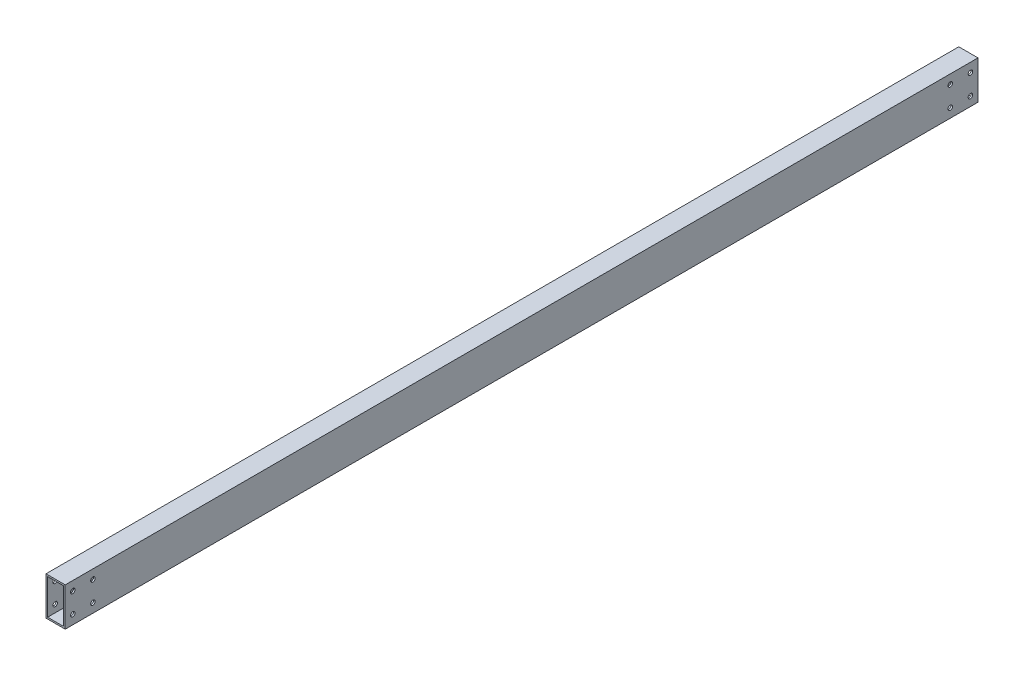
ISO-10303-21;
HEADER;
FILE_DESCRIPTION(('STEP AP214'),'2;1');
FILE_NAME('part.step','',(''),(''),'','','');
FILE_SCHEMA(('AUTOMOTIVE_DESIGN { 1 0 10303 214 1 1 1 1 }'));
ENDSEC;
DATA;
#1=APPLICATION_CONTEXT('core data for automotive mechanical design processes');
#2=APPLICATION_PROTOCOL_DEFINITION('international standard','automotive_design',2000,#1);
#3=PRODUCT_CONTEXT('',#1,'mechanical');
#4=PRODUCT('Part','Part','',(#3));
#5=PRODUCT_RELATED_PRODUCT_CATEGORY('part','',(#4));
#6=PRODUCT_DEFINITION_FORMATION('','',#4);
#7=PRODUCT_DEFINITION_CONTEXT('part definition',#1,'design');
#8=PRODUCT_DEFINITION('design','',#6,#7);
#9=PRODUCT_DEFINITION_SHAPE('','',#8);
#10=(LENGTH_UNIT() NAMED_UNIT(*) SI_UNIT(.MILLI.,.METRE.));
#11=(NAMED_UNIT(*) PLANE_ANGLE_UNIT() SI_UNIT($,.RADIAN.));
#12=(NAMED_UNIT(*) SI_UNIT($,.STERADIAN.) SOLID_ANGLE_UNIT());
#13=UNCERTAINTY_MEASURE_WITH_UNIT(LENGTH_MEASURE(1.E-05),#10,'distance_accuracy_value','');
#14=(GEOMETRIC_REPRESENTATION_CONTEXT(3) GLOBAL_UNCERTAINTY_ASSIGNED_CONTEXT((#13)) GLOBAL_UNIT_ASSIGNED_CONTEXT((#10,
#11,#12)) REPRESENTATION_CONTEXT('',''));
#15=CARTESIAN_POINT('',(0.,0.,0.));
#16=DIRECTION('',(0.,0.,1.));
#17=DIRECTION('',(1.,0.,0.));
#18=AXIS2_PLACEMENT_3D('',#15,#16,#17);
#19=CARTESIAN_POINT('',(19.05,38.1,905.));
#20=DIRECTION('',(-1.,0.,0.));
#21=DIRECTION('',(0.,-1.,0.));
#22=AXIS2_PLACEMENT_3D('',#19,#20,#21);
#23=PLANE('',#22);
#24=DIRECTION('',(0.,1.,0.));
#25=VECTOR('',#24,1.);
#26=CARTESIAN_POINT('',(19.05,38.1,-905.));
#27=LINE('',#26,#25);
#28=CARTESIAN_POINT('',(19.05,-38.1,-905.));
#29=VERTEX_POINT('',#28);
#30=CARTESIAN_POINT('',(19.05,38.1,-905.));
#31=VERTEX_POINT('',#30);
#32=EDGE_CURVE('E146',#29,#31,#27,.T.);
#33=ORIENTED_EDGE('',*,*,#32,.T.);
#34=DIRECTION('',(0.,0.,-1.));
#35=VECTOR('',#34,1.);
#36=CARTESIAN_POINT('',(19.05,38.1,905.));
#37=LINE('',#36,#35);
#38=CARTESIAN_POINT('',(19.05,38.1,905.));
#39=VERTEX_POINT('',#38);
#40=EDGE_CURVE('E12',#39,#31,#37,.T.);
#41=ORIENTED_EDGE('',*,*,#40,.F.);
#42=DIRECTION('',(0.,1.,0.));
#43=VECTOR('',#42,1.);
#44=CARTESIAN_POINT('',(19.05,38.1,905.));
#45=LINE('',#44,#43);
#46=CARTESIAN_POINT('',(19.05,-38.1,905.));
#47=VERTEX_POINT('',#46);
#48=EDGE_CURVE('E179',#47,#39,#45,.T.);
#49=ORIENTED_EDGE('',*,*,#48,.F.);
#50=DIRECTION('',(0.,0.,-1.));
#51=VECTOR('',#50,1.);
#52=CARTESIAN_POINT('',(19.05,-38.1,905.));
#53=LINE('',#52,#51);
#54=EDGE_CURVE('E193',#47,#29,#53,.T.);
#55=ORIENTED_EDGE('',*,*,#54,.T.);
#56=EDGE_LOOP('',(#33,#41,#49,#55));
#57=FACE_BOUND('',#56,.T.);
#58=CARTESIAN_POINT('',(19.05,20.,850.));
#59=DIRECTION('',(1.,0.,0.));
#60=DIRECTION('',(0.,0.,-1.));
#61=AXIS2_PLACEMENT_3D('',#58,#59,#60);
#62=CIRCLE('',#61,4.5);
#63=CARTESIAN_POINT('',(19.05,20.,845.5));
#64=VERTEX_POINT('',#63);
#65=EDGE_CURVE('E294',#64,#64,#62,.T.);
#66=ORIENTED_EDGE('',*,*,#65,.F.);
#67=EDGE_LOOP('',(#66));
#68=FACE_BOUND('',#67,.T.);
#69=CARTESIAN_POINT('',(19.05,-20.,890.));
#70=DIRECTION('',(1.,0.,0.));
#71=DIRECTION('',(0.,0.,-1.));
#72=AXIS2_PLACEMENT_3D('',#69,#70,#71);
#73=CIRCLE('',#72,4.5);
#74=CARTESIAN_POINT('',(19.05,-20.,885.5));
#75=VERTEX_POINT('',#74);
#76=EDGE_CURVE('E301',#75,#75,#73,.T.);
#77=ORIENTED_EDGE('',*,*,#76,.F.);
#78=EDGE_LOOP('',(#77));
#79=FACE_BOUND('',#78,.T.);
#80=CARTESIAN_POINT('',(19.05,-20.,850.));
#81=DIRECTION('',(1.,0.,0.));
#82=DIRECTION('',(0.,0.,-1.));
#83=AXIS2_PLACEMENT_3D('',#80,#81,#82);
#84=CIRCLE('',#83,4.5);
#85=CARTESIAN_POINT('',(19.05,-20.,845.5));
#86=VERTEX_POINT('',#85);
#87=EDGE_CURVE('E307',#86,#86,#84,.T.);
#88=ORIENTED_EDGE('',*,*,#87,.F.);
#89=EDGE_LOOP('',(#88));
#90=FACE_BOUND('',#89,.T.);
#91=CARTESIAN_POINT('',(19.05,20.,890.));
#92=DIRECTION('',(1.,0.,0.));
#93=DIRECTION('',(0.,0.,-1.));
#94=AXIS2_PLACEMENT_3D('',#91,#92,#93);
#95=CIRCLE('',#94,4.5);
#96=CARTESIAN_POINT('',(19.05,20.,885.5));
#97=VERTEX_POINT('',#96);
#98=EDGE_CURVE('E313',#97,#97,#95,.T.);
#99=ORIENTED_EDGE('',*,*,#98,.F.);
#100=EDGE_LOOP('',(#99));
#101=FACE_BOUND('',#100,.T.);
#102=CARTESIAN_POINT('',(19.05,20.,-850.));
#103=DIRECTION('',(1.,0.,0.));
#104=DIRECTION('',(0.,0.,-1.));
#105=AXIS2_PLACEMENT_3D('',#102,#103,#104);
#106=CIRCLE('',#105,4.5);
#107=CARTESIAN_POINT('',(19.05,20.,-854.5));
#108=VERTEX_POINT('',#107);
#109=EDGE_CURVE('E351',#108,#108,#106,.T.);
#110=ORIENTED_EDGE('',*,*,#109,.F.);
#111=EDGE_LOOP('',(#110));
#112=FACE_BOUND('',#111,.T.);
#113=CARTESIAN_POINT('',(19.05,-20.,-890.));
#114=DIRECTION('',(1.,0.,0.));
#115=DIRECTION('',(0.,0.,-1.));
#116=AXIS2_PLACEMENT_3D('',#113,#114,#115);
#117=CIRCLE('',#116,4.5);
#118=CARTESIAN_POINT('',(19.05,-20.,-894.5));
#119=VERTEX_POINT('',#118);
#120=EDGE_CURVE('E357',#119,#119,#117,.T.);
#121=ORIENTED_EDGE('',*,*,#120,.F.);
#122=EDGE_LOOP('',(#121));
#123=FACE_BOUND('',#122,.T.);
#124=CARTESIAN_POINT('',(19.05,-20.,-850.));
#125=DIRECTION('',(1.,0.,0.));
#126=DIRECTION('',(0.,0.,-1.));
#127=AXIS2_PLACEMENT_3D('',#124,#125,#126);
#128=CIRCLE('',#127,4.5);
#129=CARTESIAN_POINT('',(19.05,-20.,-854.5));
#130=VERTEX_POINT('',#129);
#131=EDGE_CURVE('E363',#130,#130,#128,.T.);
#132=ORIENTED_EDGE('',*,*,#131,.F.);
#133=EDGE_LOOP('',(#132));
#134=FACE_BOUND('',#133,.T.);
#135=CARTESIAN_POINT('',(19.05,20.,-890.));
#136=DIRECTION('',(1.,0.,0.));
#137=DIRECTION('',(0.,0.,-1.));
#138=AXIS2_PLACEMENT_3D('',#135,#136,#137);
#139=CIRCLE('',#138,4.5);
#140=CARTESIAN_POINT('',(19.05,20.,-894.5));
#141=VERTEX_POINT('',#140);
#142=EDGE_CURVE('E369',#141,#141,#139,.T.);
#143=ORIENTED_EDGE('',*,*,#142,.F.);
#144=EDGE_LOOP('',(#143));
#145=FACE_BOUND('',#144,.T.);
#146=ADVANCED_FACE('F63',(#57,#68,#79,#90,#101,#112,#123,#134,#145),#23,.F.);
#147=CARTESIAN_POINT('',(0.,0.,905.));
#148=DIRECTION('',(0.,0.,1.));
#149=DIRECTION('',(1.,0.,0.));
#150=AXIS2_PLACEMENT_3D('',#147,#148,#149);
#151=PLANE('',#150);
#152=ORIENTED_EDGE('',*,*,#48,.T.);
#153=DIRECTION('',(-1.,0.,0.));
#154=VECTOR('',#153,1.);
#155=CARTESIAN_POINT('',(-19.05,38.1,905.));
#156=LINE('',#155,#154);
#157=CARTESIAN_POINT('',(-19.05,38.1,905.));
#158=VERTEX_POINT('',#157);
#159=EDGE_CURVE('E183',#39,#158,#156,.T.);
#160=ORIENTED_EDGE('',*,*,#159,.T.);
#161=DIRECTION('',(0.,-1.,0.));
#162=VECTOR('',#161,1.);
#163=CARTESIAN_POINT('',(-19.05,38.1,905.));
#164=LINE('',#163,#162);
#165=CARTESIAN_POINT('',(-19.05,-38.1,905.));
#166=VERTEX_POINT('',#165);
#167=EDGE_CURVE('E187',#158,#166,#164,.T.);
#168=ORIENTED_EDGE('',*,*,#167,.T.);
#169=DIRECTION('',(1.,0.,0.));
#170=VECTOR('',#169,1.);
#171=CARTESIAN_POINT('',(-19.05,-38.1,905.));
#172=LINE('',#171,#170);
#173=EDGE_CURVE('E190',#166,#47,#172,.T.);
#174=ORIENTED_EDGE('',*,*,#173,.T.);
#175=EDGE_LOOP('',(#152,#160,#168,#174));
#176=FACE_BOUND('',#175,.T.);
#177=DIRECTION('',(-1.,0.,0.));
#178=VECTOR('',#177,1.);
#179=CARTESIAN_POINT('',(-19.05,34.925,905.));
#180=LINE('',#179,#178);
#181=CARTESIAN_POINT('',(15.875,34.925,905.));
#182=VERTEX_POINT('',#181);
#183=CARTESIAN_POINT('',(-15.875,34.925,905.));
#184=VERTEX_POINT('',#183);
#185=EDGE_CURVE('E137',#182,#184,#180,.T.);
#186=ORIENTED_EDGE('',*,*,#185,.F.);
#187=DIRECTION('',(0.,1.,0.));
#188=VECTOR('',#187,1.);
#189=CARTESIAN_POINT('',(15.875,38.1,905.));
#190=LINE('',#189,#188);
#191=CARTESIAN_POINT('',(15.875,-34.925,905.));
#192=VERTEX_POINT('',#191);
#193=EDGE_CURVE('E128',#192,#182,#190,.T.);
#194=ORIENTED_EDGE('',*,*,#193,.F.);
#195=DIRECTION('',(1.,0.,0.));
#196=VECTOR('',#195,1.);
#197=CARTESIAN_POINT('',(-19.05,-34.925,905.));
#198=LINE('',#197,#196);
#199=CARTESIAN_POINT('',(-15.875,-34.925,905.));
#200=VERTEX_POINT('',#199);
#201=EDGE_CURVE('E155',#200,#192,#198,.T.);
#202=ORIENTED_EDGE('',*,*,#201,.F.);
#203=DIRECTION('',(0.,-1.,0.));
#204=VECTOR('',#203,1.);
#205=CARTESIAN_POINT('',(-15.875,38.1,905.));
#206=LINE('',#205,#204);
#207=EDGE_CURVE('E151',#184,#200,#206,.T.);
#208=ORIENTED_EDGE('',*,*,#207,.F.);
#209=EDGE_LOOP('',(#186,#194,#202,#208));
#210=FACE_BOUND('',#209,.T.);
#211=ADVANCED_FACE('F150',(#176,#210),#151,.T.);
#212=CARTESIAN_POINT('',(0.,0.,-905.));
#213=DIRECTION('',(0.,0.,1.));
#214=DIRECTION('',(1.,0.,0.));
#215=AXIS2_PLACEMENT_3D('',#212,#213,#214);
#216=PLANE('',#215);
#217=ORIENTED_EDGE('',*,*,#32,.F.);
#218=DIRECTION('',(1.,0.,0.));
#219=VECTOR('',#218,1.);
#220=CARTESIAN_POINT('',(-19.05,-38.1,-905.));
#221=LINE('',#220,#219);
#222=CARTESIAN_POINT('',(-19.05,-38.1,-905.));
#223=VERTEX_POINT('',#222);
#224=EDGE_CURVE('E184',#223,#29,#221,.T.);
#225=ORIENTED_EDGE('',*,*,#224,.F.);
#226=DIRECTION('',(0.,-1.,0.));
#227=VECTOR('',#226,1.);
#228=CARTESIAN_POINT('',(-19.05,38.1,-905.));
#229=LINE('',#228,#227);
#230=CARTESIAN_POINT('',(-19.05,38.1,-905.));
#231=VERTEX_POINT('',#230);
#232=EDGE_CURVE('E200',#231,#223,#229,.T.);
#233=ORIENTED_EDGE('',*,*,#232,.F.);
#234=DIRECTION('',(-1.,0.,0.));
#235=VECTOR('',#234,1.);
#236=CARTESIAN_POINT('',(-19.05,38.1,-905.));
#237=LINE('',#236,#235);
#238=EDGE_CURVE('E197',#31,#231,#237,.T.);
#239=ORIENTED_EDGE('',*,*,#238,.F.);
#240=EDGE_LOOP('',(#217,#225,#233,#239));
#241=FACE_BOUND('',#240,.T.);
#242=DIRECTION('',(0.,1.,0.));
#243=VECTOR('',#242,1.);
#244=CARTESIAN_POINT('',(15.875,38.1,-905.));
#245=LINE('',#244,#243);
#246=CARTESIAN_POINT('',(15.875,-34.925,-905.));
#247=VERTEX_POINT('',#246);
#248=CARTESIAN_POINT('',(15.875,34.925,-905.));
#249=VERTEX_POINT('',#248);
#250=EDGE_CURVE('E86',#247,#249,#245,.T.);
#251=ORIENTED_EDGE('',*,*,#250,.T.);
#252=DIRECTION('',(-1.,0.,0.));
#253=VECTOR('',#252,1.);
#254=CARTESIAN_POINT('',(-19.05,34.925,-905.));
#255=LINE('',#254,#253);
#256=CARTESIAN_POINT('',(-15.875,34.925,-905.));
#257=VERTEX_POINT('',#256);
#258=EDGE_CURVE('E144',#249,#257,#255,.T.);
#259=ORIENTED_EDGE('',*,*,#258,.T.);
#260=DIRECTION('',(0.,-1.,0.));
#261=VECTOR('',#260,1.);
#262=CARTESIAN_POINT('',(-15.875,38.1,-905.));
#263=LINE('',#262,#261);
#264=CARTESIAN_POINT('',(-15.875,-34.925,-905.));
#265=VERTEX_POINT('',#264);
#266=EDGE_CURVE('E166',#257,#265,#263,.T.);
#267=ORIENTED_EDGE('',*,*,#266,.T.);
#268=DIRECTION('',(1.,0.,0.));
#269=VECTOR('',#268,1.);
#270=CARTESIAN_POINT('',(-19.05,-34.925,-905.));
#271=LINE('',#270,#269);
#272=EDGE_CURVE('E138',#265,#247,#271,.T.);
#273=ORIENTED_EDGE('',*,*,#272,.T.);
#274=EDGE_LOOP('',(#251,#259,#267,#273));
#275=FACE_BOUND('',#274,.T.);
#276=ADVANCED_FACE('F223',(#241,#275),#216,.F.);
#277=CARTESIAN_POINT('',(-19.05,38.1,905.));
#278=DIRECTION('',(0.,-1.,0.));
#279=DIRECTION('',(0.,0.,-1.));
#280=AXIS2_PLACEMENT_3D('',#277,#278,#279);
#281=PLANE('',#280);
#282=ORIENTED_EDGE('',*,*,#238,.T.);
#283=DIRECTION('',(0.,0.,-1.));
#284=VECTOR('',#283,1.);
#285=CARTESIAN_POINT('',(-19.05,38.1,905.));
#286=LINE('',#285,#284);
#287=EDGE_CURVE('E71',#158,#231,#286,.T.);
#288=ORIENTED_EDGE('',*,*,#287,.F.);
#289=ORIENTED_EDGE('',*,*,#159,.F.);
#290=ORIENTED_EDGE('',*,*,#40,.T.);
#291=EDGE_LOOP('',(#282,#288,#289,#290));
#292=FACE_BOUND('',#291,.T.);
#293=ADVANCED_FACE('F234',(#292),#281,.F.);
#294=CARTESIAN_POINT('',(-19.05,38.1,905.));
#295=DIRECTION('',(1.,0.,0.));
#296=DIRECTION('',(0.,1.,0.));
#297=AXIS2_PLACEMENT_3D('',#294,#295,#296);
#298=PLANE('',#297);
#299=CARTESIAN_POINT('',(-19.05,20.,-890.));
#300=DIRECTION('',(1.,0.,0.));
#301=DIRECTION('',(0.,1.,0.));
#302=AXIS2_PLACEMENT_3D('',#299,#300,#301);
#303=CIRCLE('',#302,4.5);
#304=CARTESIAN_POINT('',(-19.05,24.5,-890.));
#305=VERTEX_POINT('',#304);
#306=EDGE_CURVE('E397',#305,#305,#303,.T.);
#307=ORIENTED_EDGE('',*,*,#306,.T.);
#308=EDGE_LOOP('',(#307));
#309=FACE_BOUND('',#308,.T.);
#310=CARTESIAN_POINT('',(-19.05,20.,-850.));
#311=DIRECTION('',(1.,0.,0.));
#312=DIRECTION('',(0.,1.,0.));
#313=AXIS2_PLACEMENT_3D('',#310,#311,#312);
#314=CIRCLE('',#313,4.5);
#315=CARTESIAN_POINT('',(-19.05,24.5,-850.));
#316=VERTEX_POINT('',#315);
#317=EDGE_CURVE('E389',#316,#316,#314,.T.);
#318=ORIENTED_EDGE('',*,*,#317,.T.);
#319=EDGE_LOOP('',(#318));
#320=FACE_BOUND('',#319,.T.);
#321=CARTESIAN_POINT('',(-19.05,-20.,-850.));
#322=DIRECTION('',(1.,0.,0.));
#323=DIRECTION('',(0.,1.,0.));
#324=AXIS2_PLACEMENT_3D('',#321,#322,#323);
#325=CIRCLE('',#324,4.5);
#326=CARTESIAN_POINT('',(-19.05,-15.5,-850.));
#327=VERTEX_POINT('',#326);
#328=EDGE_CURVE('E381',#327,#327,#325,.T.);
#329=ORIENTED_EDGE('',*,*,#328,.T.);
#330=EDGE_LOOP('',(#329));
#331=FACE_BOUND('',#330,.T.);
#332=CARTESIAN_POINT('',(-19.05,-20.,-890.));
#333=DIRECTION('',(1.,0.,0.));
#334=DIRECTION('',(0.,1.,0.));
#335=AXIS2_PLACEMENT_3D('',#332,#333,#334);
#336=CIRCLE('',#335,4.5);
#337=CARTESIAN_POINT('',(-19.05,-15.5,-890.));
#338=VERTEX_POINT('',#337);
#339=EDGE_CURVE('E373',#338,#338,#336,.T.);
#340=ORIENTED_EDGE('',*,*,#339,.T.);
#341=EDGE_LOOP('',(#340));
#342=FACE_BOUND('',#341,.T.);
#343=CARTESIAN_POINT('',(-19.05,20.,890.));
#344=DIRECTION('',(1.,0.,0.));
#345=DIRECTION('',(0.,1.,0.));
#346=AXIS2_PLACEMENT_3D('',#343,#344,#345);
#347=CIRCLE('',#346,4.5);
#348=CARTESIAN_POINT('',(-19.05,24.5,890.));
#349=VERTEX_POINT('',#348);
#350=EDGE_CURVE('E341',#349,#349,#347,.T.);
#351=ORIENTED_EDGE('',*,*,#350,.T.);
#352=EDGE_LOOP('',(#351));
#353=FACE_BOUND('',#352,.T.);
#354=CARTESIAN_POINT('',(-19.05,20.,850.));
#355=DIRECTION('',(1.,0.,0.));
#356=DIRECTION('',(0.,1.,0.));
#357=AXIS2_PLACEMENT_3D('',#354,#355,#356);
#358=CIRCLE('',#357,4.5);
#359=CARTESIAN_POINT('',(-19.05,24.5,850.));
#360=VERTEX_POINT('',#359);
#361=EDGE_CURVE('E333',#360,#360,#358,.T.);
#362=ORIENTED_EDGE('',*,*,#361,.T.);
#363=EDGE_LOOP('',(#362));
#364=FACE_BOUND('',#363,.T.);
#365=CARTESIAN_POINT('',(-19.05,-20.,850.));
#366=DIRECTION('',(1.,0.,0.));
#367=DIRECTION('',(0.,1.,0.));
#368=AXIS2_PLACEMENT_3D('',#365,#366,#367);
#369=CIRCLE('',#368,4.5);
#370=CARTESIAN_POINT('',(-19.05,-15.5,850.));
#371=VERTEX_POINT('',#370);
#372=EDGE_CURVE('E325',#371,#371,#369,.T.);
#373=ORIENTED_EDGE('',*,*,#372,.T.);
#374=EDGE_LOOP('',(#373));
#375=FACE_BOUND('',#374,.T.);
#376=CARTESIAN_POINT('',(-19.05,-20.,890.));
#377=DIRECTION('',(1.,0.,0.));
#378=DIRECTION('',(0.,1.,0.));
#379=AXIS2_PLACEMENT_3D('',#376,#377,#378);
#380=CIRCLE('',#379,4.5);
#381=CARTESIAN_POINT('',(-19.05,-15.5,890.));
#382=VERTEX_POINT('',#381);
#383=EDGE_CURVE('E317',#382,#382,#380,.T.);
#384=ORIENTED_EDGE('',*,*,#383,.T.);
#385=EDGE_LOOP('',(#384));
#386=FACE_BOUND('',#385,.T.);
#387=ORIENTED_EDGE('',*,*,#232,.T.);
#388=DIRECTION('',(0.,0.,-1.));
#389=VECTOR('',#388,1.);
#390=CARTESIAN_POINT('',(-19.05,-38.1,905.));
#391=LINE('',#390,#389);
#392=EDGE_CURVE('E208',#166,#223,#391,.T.);
#393=ORIENTED_EDGE('',*,*,#392,.F.);
#394=ORIENTED_EDGE('',*,*,#167,.F.);
#395=ORIENTED_EDGE('',*,*,#287,.T.);
#396=EDGE_LOOP('',(#387,#393,#394,#395));
#397=FACE_BOUND('',#396,.T.);
#398=ADVANCED_FACE('F217',(#309,#320,#331,#342,#353,#364,#375,#386,#397),#298,.F.);
#399=CARTESIAN_POINT('',(-19.05,-38.1,905.));
#400=DIRECTION('',(0.,1.,0.));
#401=DIRECTION('',(0.,0.,1.));
#402=AXIS2_PLACEMENT_3D('',#399,#400,#401);
#403=PLANE('',#402);
#404=ORIENTED_EDGE('',*,*,#224,.T.);
#405=ORIENTED_EDGE('',*,*,#54,.F.);
#406=ORIENTED_EDGE('',*,*,#173,.F.);
#407=ORIENTED_EDGE('',*,*,#392,.T.);
#408=EDGE_LOOP('',(#404,#405,#406,#407));
#409=FACE_BOUND('',#408,.T.);
#410=ADVANCED_FACE('F227',(#409),#403,.F.);
#411=CARTESIAN_POINT('',(15.875,38.1,905.));
#412=DIRECTION('',(-1.,0.,0.));
#413=DIRECTION('',(0.,-1.,0.));
#414=AXIS2_PLACEMENT_3D('',#411,#412,#413);
#415=PLANE('',#414);
#416=CARTESIAN_POINT('',(15.875,20.,-890.));
#417=DIRECTION('',(-1.,0.,0.));
#418=DIRECTION('',(0.,-1.,0.));
#419=AXIS2_PLACEMENT_3D('',#416,#417,#418);
#420=CIRCLE('',#419,4.5);
#421=CARTESIAN_POINT('',(15.875,15.5,-890.));
#422=VERTEX_POINT('',#421);
#423=EDGE_CURVE('E265',#422,#422,#420,.T.);
#424=ORIENTED_EDGE('',*,*,#423,.F.);
#425=EDGE_LOOP('',(#424));
#426=FACE_BOUND('',#425,.T.);
#427=CARTESIAN_POINT('',(15.875,-20.,-850.));
#428=DIRECTION('',(-1.,0.,0.));
#429=DIRECTION('',(0.,-1.,0.));
#430=AXIS2_PLACEMENT_3D('',#427,#428,#429);
#431=CIRCLE('',#430,4.5);
#432=CARTESIAN_POINT('',(15.875,-24.5,-850.));
#433=VERTEX_POINT('',#432);
#434=EDGE_CURVE('E269',#433,#433,#431,.T.);
#435=ORIENTED_EDGE('',*,*,#434,.F.);
#436=EDGE_LOOP('',(#435));
#437=FACE_BOUND('',#436,.T.);
#438=CARTESIAN_POINT('',(15.875,-20.,-890.));
#439=DIRECTION('',(-1.,0.,0.));
#440=DIRECTION('',(0.,-1.,0.));
#441=AXIS2_PLACEMENT_3D('',#438,#439,#440);
#442=CIRCLE('',#441,4.5);
#443=CARTESIAN_POINT('',(15.875,-24.5,-890.));
#444=VERTEX_POINT('',#443);
#445=EDGE_CURVE('E273',#444,#444,#442,.T.);
#446=ORIENTED_EDGE('',*,*,#445,.F.);
#447=EDGE_LOOP('',(#446));
#448=FACE_BOUND('',#447,.T.);
#449=CARTESIAN_POINT('',(15.875,20.,-850.));
#450=DIRECTION('',(-1.,0.,0.));
#451=DIRECTION('',(0.,-1.,0.));
#452=AXIS2_PLACEMENT_3D('',#449,#450,#451);
#453=CIRCLE('',#452,4.5);
#454=CARTESIAN_POINT('',(15.875,15.5,-850.));
#455=VERTEX_POINT('',#454);
#456=EDGE_CURVE('E277',#455,#455,#453,.T.);
#457=ORIENTED_EDGE('',*,*,#456,.F.);
#458=EDGE_LOOP('',(#457));
#459=FACE_BOUND('',#458,.T.);
#460=CARTESIAN_POINT('',(15.875,20.,890.));
#461=DIRECTION('',(-1.,0.,0.));
#462=DIRECTION('',(0.,-1.,0.));
#463=AXIS2_PLACEMENT_3D('',#460,#461,#462);
#464=CIRCLE('',#463,4.5);
#465=CARTESIAN_POINT('',(15.875,15.5,890.));
#466=VERTEX_POINT('',#465);
#467=EDGE_CURVE('E281',#466,#466,#464,.T.);
#468=ORIENTED_EDGE('',*,*,#467,.F.);
#469=EDGE_LOOP('',(#468));
#470=FACE_BOUND('',#469,.T.);
#471=CARTESIAN_POINT('',(15.875,-20.,850.));
#472=DIRECTION('',(-1.,0.,0.));
#473=DIRECTION('',(0.,-1.,0.));
#474=AXIS2_PLACEMENT_3D('',#471,#472,#473);
#475=CIRCLE('',#474,4.5);
#476=CARTESIAN_POINT('',(15.875,-24.5,850.));
#477=VERTEX_POINT('',#476);
#478=EDGE_CURVE('E285',#477,#477,#475,.T.);
#479=ORIENTED_EDGE('',*,*,#478,.F.);
#480=EDGE_LOOP('',(#479));
#481=FACE_BOUND('',#480,.T.);
#482=CARTESIAN_POINT('',(15.875,-20.,890.));
#483=DIRECTION('',(-1.,0.,0.));
#484=DIRECTION('',(0.,-1.,0.));
#485=AXIS2_PLACEMENT_3D('',#482,#483,#484);
#486=CIRCLE('',#485,4.5);
#487=CARTESIAN_POINT('',(15.875,-24.5,890.));
#488=VERTEX_POINT('',#487);
#489=EDGE_CURVE('E289',#488,#488,#486,.T.);
#490=ORIENTED_EDGE('',*,*,#489,.F.);
#491=EDGE_LOOP('',(#490));
#492=FACE_BOUND('',#491,.T.);
#493=CARTESIAN_POINT('',(15.875,20.,850.));
#494=DIRECTION('',(-1.,0.,0.));
#495=DIRECTION('',(0.,-1.,0.));
#496=AXIS2_PLACEMENT_3D('',#493,#494,#495);
#497=CIRCLE('',#496,4.5);
#498=CARTESIAN_POINT('',(15.875,15.5,850.));
#499=VERTEX_POINT('',#498);
#500=EDGE_CURVE('E163',#499,#499,#497,.T.);
#501=ORIENTED_EDGE('',*,*,#500,.F.);
#502=EDGE_LOOP('',(#501));
#503=FACE_BOUND('',#502,.T.);
#504=ORIENTED_EDGE('',*,*,#250,.F.);
#505=DIRECTION('',(0.,0.,-1.));
#506=VECTOR('',#505,1.);
#507=CARTESIAN_POINT('',(15.875,-34.925,905.));
#508=LINE('',#507,#506);
#509=EDGE_CURVE('E132',#192,#247,#508,.T.);
#510=ORIENTED_EDGE('',*,*,#509,.F.);
#511=ORIENTED_EDGE('',*,*,#193,.T.);
#512=DIRECTION('',(0.,0.,-1.));
#513=VECTOR('',#512,1.);
#514=CARTESIAN_POINT('',(15.875,34.925,905.));
#515=LINE('',#514,#513);
#516=EDGE_CURVE('E131',#182,#249,#515,.T.);
#517=ORIENTED_EDGE('',*,*,#516,.T.);
#518=EDGE_LOOP('',(#504,#510,#511,#517));
#519=FACE_BOUND('',#518,.T.);
#520=ADVANCED_FACE('F130',(#426,#437,#448,#459,#470,#481,#492,#503,#519),#415,.T.);
#521=CARTESIAN_POINT('',(-19.05,34.925,905.));
#522=DIRECTION('',(0.,-1.,0.));
#523=DIRECTION('',(0.,0.,-1.));
#524=AXIS2_PLACEMENT_3D('',#521,#522,#523);
#525=PLANE('',#524);
#526=ORIENTED_EDGE('',*,*,#258,.F.);
#527=ORIENTED_EDGE('',*,*,#516,.F.);
#528=ORIENTED_EDGE('',*,*,#185,.T.);
#529=DIRECTION('',(0.,0.,-1.));
#530=VECTOR('',#529,1.);
#531=CARTESIAN_POINT('',(-15.875,34.925,905.));
#532=LINE('',#531,#530);
#533=EDGE_CURVE('E147',#184,#257,#532,.T.);
#534=ORIENTED_EDGE('',*,*,#533,.T.);
#535=EDGE_LOOP('',(#526,#527,#528,#534));
#536=FACE_BOUND('',#535,.T.);
#537=ADVANCED_FACE('F141',(#536),#525,.T.);
#538=CARTESIAN_POINT('',(-15.875,38.1,905.));
#539=DIRECTION('',(1.,0.,0.));
#540=DIRECTION('',(0.,1.,0.));
#541=AXIS2_PLACEMENT_3D('',#538,#539,#540);
#542=PLANE('',#541);
#543=CARTESIAN_POINT('',(-15.875,20.,-890.));
#544=DIRECTION('',(1.,0.,0.));
#545=DIRECTION('',(0.,0.,-1.));
#546=AXIS2_PLACEMENT_3D('',#543,#544,#545);
#547=CIRCLE('',#546,4.5);
#548=CARTESIAN_POINT('',(-15.875,20.,-894.5));
#549=VERTEX_POINT('',#548);
#550=EDGE_CURVE('E401',#549,#549,#547,.T.);
#551=ORIENTED_EDGE('',*,*,#550,.F.);
#552=EDGE_LOOP('',(#551));
#553=FACE_BOUND('',#552,.T.);
#554=CARTESIAN_POINT('',(-15.875,20.,-850.));
#555=DIRECTION('',(1.,0.,0.));
#556=DIRECTION('',(0.,0.,-1.));
#557=AXIS2_PLACEMENT_3D('',#554,#555,#556);
#558=CIRCLE('',#557,4.5);
#559=CARTESIAN_POINT('',(-15.875,20.,-854.5));
#560=VERTEX_POINT('',#559);
#561=EDGE_CURVE('E393',#560,#560,#558,.T.);
#562=ORIENTED_EDGE('',*,*,#561,.F.);
#563=EDGE_LOOP('',(#562));
#564=FACE_BOUND('',#563,.T.);
#565=CARTESIAN_POINT('',(-15.875,-20.,-850.));
#566=DIRECTION('',(1.,0.,0.));
#567=DIRECTION('',(0.,0.,-1.));
#568=AXIS2_PLACEMENT_3D('',#565,#566,#567);
#569=CIRCLE('',#568,4.5);
#570=CARTESIAN_POINT('',(-15.875,-20.,-854.5));
#571=VERTEX_POINT('',#570);
#572=EDGE_CURVE('E385',#571,#571,#569,.T.);
#573=ORIENTED_EDGE('',*,*,#572,.F.);
#574=EDGE_LOOP('',(#573));
#575=FACE_BOUND('',#574,.T.);
#576=CARTESIAN_POINT('',(-15.875,-20.,-890.));
#577=DIRECTION('',(1.,0.,0.));
#578=DIRECTION('',(0.,0.,-1.));
#579=AXIS2_PLACEMENT_3D('',#576,#577,#578);
#580=CIRCLE('',#579,4.5);
#581=CARTESIAN_POINT('',(-15.875,-20.,-894.5));
#582=VERTEX_POINT('',#581);
#583=EDGE_CURVE('E377',#582,#582,#580,.T.);
#584=ORIENTED_EDGE('',*,*,#583,.F.);
#585=EDGE_LOOP('',(#584));
#586=FACE_BOUND('',#585,.T.);
#587=CARTESIAN_POINT('',(-15.875,20.,890.));
#588=DIRECTION('',(1.,0.,0.));
#589=DIRECTION('',(0.,0.,-1.));
#590=AXIS2_PLACEMENT_3D('',#587,#588,#589);
#591=CIRCLE('',#590,4.5);
#592=CARTESIAN_POINT('',(-15.875,20.,885.5));
#593=VERTEX_POINT('',#592);
#594=EDGE_CURVE('E345',#593,#593,#591,.T.);
#595=ORIENTED_EDGE('',*,*,#594,.F.);
#596=EDGE_LOOP('',(#595));
#597=FACE_BOUND('',#596,.T.);
#598=CARTESIAN_POINT('',(-15.875,20.,850.));
#599=DIRECTION('',(1.,0.,0.));
#600=DIRECTION('',(0.,0.,-1.));
#601=AXIS2_PLACEMENT_3D('',#598,#599,#600);
#602=CIRCLE('',#601,4.5);
#603=CARTESIAN_POINT('',(-15.875,20.,845.5));
#604=VERTEX_POINT('',#603);
#605=EDGE_CURVE('E337',#604,#604,#602,.T.);
#606=ORIENTED_EDGE('',*,*,#605,.F.);
#607=EDGE_LOOP('',(#606));
#608=FACE_BOUND('',#607,.T.);
#609=CARTESIAN_POINT('',(-15.875,-20.,850.));
#610=DIRECTION('',(1.,0.,0.));
#611=DIRECTION('',(0.,0.,-1.));
#612=AXIS2_PLACEMENT_3D('',#609,#610,#611);
#613=CIRCLE('',#612,4.5);
#614=CARTESIAN_POINT('',(-15.875,-20.,845.5));
#615=VERTEX_POINT('',#614);
#616=EDGE_CURVE('E329',#615,#615,#613,.T.);
#617=ORIENTED_EDGE('',*,*,#616,.F.);
#618=EDGE_LOOP('',(#617));
#619=FACE_BOUND('',#618,.T.);
#620=CARTESIAN_POINT('',(-15.875,-20.,890.));
#621=DIRECTION('',(1.,0.,0.));
#622=DIRECTION('',(0.,0.,-1.));
#623=AXIS2_PLACEMENT_3D('',#620,#621,#622);
#624=CIRCLE('',#623,4.5);
#625=CARTESIAN_POINT('',(-15.875,-20.,885.5));
#626=VERTEX_POINT('',#625);
#627=EDGE_CURVE('E321',#626,#626,#624,.T.);
#628=ORIENTED_EDGE('',*,*,#627,.F.);
#629=EDGE_LOOP('',(#628));
#630=FACE_BOUND('',#629,.T.);
#631=ORIENTED_EDGE('',*,*,#266,.F.);
#632=ORIENTED_EDGE('',*,*,#533,.F.);
#633=ORIENTED_EDGE('',*,*,#207,.T.);
#634=DIRECTION('',(0.,0.,-1.));
#635=VECTOR('',#634,1.);
#636=CARTESIAN_POINT('',(-15.875,-34.925,905.));
#637=LINE('',#636,#635);
#638=EDGE_CURVE('E78',#200,#265,#637,.T.);
#639=ORIENTED_EDGE('',*,*,#638,.T.);
#640=EDGE_LOOP('',(#631,#632,#633,#639));
#641=FACE_BOUND('',#640,.T.);
#642=ADVANCED_FACE('F261',(#553,#564,#575,#586,#597,#608,#619,#630,#641),#542,.T.);
#643=CARTESIAN_POINT('',(-19.05,-34.925,905.));
#644=DIRECTION('',(0.,1.,0.));
#645=DIRECTION('',(0.,0.,1.));
#646=AXIS2_PLACEMENT_3D('',#643,#644,#645);
#647=PLANE('',#646);
#648=ORIENTED_EDGE('',*,*,#272,.F.);
#649=ORIENTED_EDGE('',*,*,#638,.F.);
#650=ORIENTED_EDGE('',*,*,#201,.T.);
#651=ORIENTED_EDGE('',*,*,#509,.T.);
#652=EDGE_LOOP('',(#648,#649,#650,#651));
#653=FACE_BOUND('',#652,.T.);
#654=ADVANCED_FACE('F410',(#653),#647,.T.);
#655=CARTESIAN_POINT('',(19.05,20.,850.));
#656=DIRECTION('',(1.,0.,0.));
#657=DIRECTION('',(0.,0.,-1.));
#658=AXIS2_PLACEMENT_3D('',#655,#656,#657);
#659=CYLINDRICAL_SURFACE('',#658,4.5);
#660=ORIENTED_EDGE('',*,*,#65,.T.);
#661=EDGE_LOOP('',(#660));
#662=FACE_BOUND('',#661,.T.);
#663=ORIENTED_EDGE('',*,*,#500,.T.);
#664=EDGE_LOOP('',(#663));
#665=FACE_BOUND('',#664,.T.);
#666=ADVANCED_FACE('F428',(#662,#665),#659,.F.);
#667=CARTESIAN_POINT('',(19.05,-20.,890.));
#668=DIRECTION('',(1.,0.,0.));
#669=DIRECTION('',(0.,0.,-1.));
#670=AXIS2_PLACEMENT_3D('',#667,#668,#669);
#671=CYLINDRICAL_SURFACE('',#670,4.5);
#672=ORIENTED_EDGE('',*,*,#76,.T.);
#673=EDGE_LOOP('',(#672));
#674=FACE_BOUND('',#673,.T.);
#675=ORIENTED_EDGE('',*,*,#489,.T.);
#676=EDGE_LOOP('',(#675));
#677=FACE_BOUND('',#676,.T.);
#678=ADVANCED_FACE('F433',(#674,#677),#671,.F.);
#679=CARTESIAN_POINT('',(19.05,-20.,850.));
#680=DIRECTION('',(1.,0.,0.));
#681=DIRECTION('',(0.,0.,-1.));
#682=AXIS2_PLACEMENT_3D('',#679,#680,#681);
#683=CYLINDRICAL_SURFACE('',#682,4.5);
#684=ORIENTED_EDGE('',*,*,#87,.T.);
#685=EDGE_LOOP('',(#684));
#686=FACE_BOUND('',#685,.T.);
#687=ORIENTED_EDGE('',*,*,#478,.T.);
#688=EDGE_LOOP('',(#687));
#689=FACE_BOUND('',#688,.T.);
#690=ADVANCED_FACE('F439',(#686,#689),#683,.F.);
#691=CARTESIAN_POINT('',(19.05,20.,890.));
#692=DIRECTION('',(1.,0.,0.));
#693=DIRECTION('',(0.,0.,-1.));
#694=AXIS2_PLACEMENT_3D('',#691,#692,#693);
#695=CYLINDRICAL_SURFACE('',#694,4.5);
#696=ORIENTED_EDGE('',*,*,#98,.T.);
#697=EDGE_LOOP('',(#696));
#698=FACE_BOUND('',#697,.T.);
#699=ORIENTED_EDGE('',*,*,#467,.T.);
#700=EDGE_LOOP('',(#699));
#701=FACE_BOUND('',#700,.T.);
#702=ADVANCED_FACE('F443',(#698,#701),#695,.F.);
#703=CARTESIAN_POINT('',(-15.875,-20.,890.));
#704=DIRECTION('',(1.,0.,0.));
#705=DIRECTION('',(0.,0.,-1.));
#706=AXIS2_PLACEMENT_3D('',#703,#704,#705);
#707=CYLINDRICAL_SURFACE('',#706,4.5);
#708=ORIENTED_EDGE('',*,*,#383,.F.);
#709=EDGE_LOOP('',(#708));
#710=FACE_BOUND('',#709,.T.);
#711=ORIENTED_EDGE('',*,*,#627,.T.);
#712=EDGE_LOOP('',(#711));
#713=FACE_BOUND('',#712,.T.);
#714=ADVANCED_FACE('F447',(#710,#713),#707,.F.);
#715=CARTESIAN_POINT('',(-15.875,-20.,850.));
#716=DIRECTION('',(1.,0.,0.));
#717=DIRECTION('',(0.,0.,-1.));
#718=AXIS2_PLACEMENT_3D('',#715,#716,#717);
#719=CYLINDRICAL_SURFACE('',#718,4.5);
#720=ORIENTED_EDGE('',*,*,#372,.F.);
#721=EDGE_LOOP('',(#720));
#722=FACE_BOUND('',#721,.T.);
#723=ORIENTED_EDGE('',*,*,#616,.T.);
#724=EDGE_LOOP('',(#723));
#725=FACE_BOUND('',#724,.T.);
#726=ADVANCED_FACE('F451',(#722,#725),#719,.F.);
#727=CARTESIAN_POINT('',(-15.875,20.,850.));
#728=DIRECTION('',(1.,0.,0.));
#729=DIRECTION('',(0.,0.,-1.));
#730=AXIS2_PLACEMENT_3D('',#727,#728,#729);
#731=CYLINDRICAL_SURFACE('',#730,4.5);
#732=ORIENTED_EDGE('',*,*,#361,.F.);
#733=EDGE_LOOP('',(#732));
#734=FACE_BOUND('',#733,.T.);
#735=ORIENTED_EDGE('',*,*,#605,.T.);
#736=EDGE_LOOP('',(#735));
#737=FACE_BOUND('',#736,.T.);
#738=ADVANCED_FACE('F455',(#734,#737),#731,.F.);
#739=CARTESIAN_POINT('',(-15.875,20.,890.));
#740=DIRECTION('',(1.,0.,0.));
#741=DIRECTION('',(0.,0.,-1.));
#742=AXIS2_PLACEMENT_3D('',#739,#740,#741);
#743=CYLINDRICAL_SURFACE('',#742,4.5);
#744=ORIENTED_EDGE('',*,*,#350,.F.);
#745=EDGE_LOOP('',(#744));
#746=FACE_BOUND('',#745,.T.);
#747=ORIENTED_EDGE('',*,*,#594,.T.);
#748=EDGE_LOOP('',(#747));
#749=FACE_BOUND('',#748,.T.);
#750=ADVANCED_FACE('F459',(#746,#749),#743,.F.);
#751=CARTESIAN_POINT('',(19.05,20.,-850.));
#752=DIRECTION('',(1.,0.,0.));
#753=DIRECTION('',(0.,0.,-1.));
#754=AXIS2_PLACEMENT_3D('',#751,#752,#753);
#755=CYLINDRICAL_SURFACE('',#754,4.5);
#756=ORIENTED_EDGE('',*,*,#109,.T.);
#757=EDGE_LOOP('',(#756));
#758=FACE_BOUND('',#757,.T.);
#759=ORIENTED_EDGE('',*,*,#456,.T.);
#760=EDGE_LOOP('',(#759));
#761=FACE_BOUND('',#760,.T.);
#762=ADVANCED_FACE('F463',(#758,#761),#755,.F.);
#763=CARTESIAN_POINT('',(19.05,-20.,-890.));
#764=DIRECTION('',(1.,0.,0.));
#765=DIRECTION('',(0.,0.,-1.));
#766=AXIS2_PLACEMENT_3D('',#763,#764,#765);
#767=CYLINDRICAL_SURFACE('',#766,4.5);
#768=ORIENTED_EDGE('',*,*,#120,.T.);
#769=EDGE_LOOP('',(#768));
#770=FACE_BOUND('',#769,.T.);
#771=ORIENTED_EDGE('',*,*,#445,.T.);
#772=EDGE_LOOP('',(#771));
#773=FACE_BOUND('',#772,.T.);
#774=ADVANCED_FACE('F467',(#770,#773),#767,.F.);
#775=CARTESIAN_POINT('',(19.05,-20.,-850.));
#776=DIRECTION('',(1.,0.,0.));
#777=DIRECTION('',(0.,0.,-1.));
#778=AXIS2_PLACEMENT_3D('',#775,#776,#777);
#779=CYLINDRICAL_SURFACE('',#778,4.5);
#780=ORIENTED_EDGE('',*,*,#131,.T.);
#781=EDGE_LOOP('',(#780));
#782=FACE_BOUND('',#781,.T.);
#783=ORIENTED_EDGE('',*,*,#434,.T.);
#784=EDGE_LOOP('',(#783));
#785=FACE_BOUND('',#784,.T.);
#786=ADVANCED_FACE('F471',(#782,#785),#779,.F.);
#787=CARTESIAN_POINT('',(19.05,20.,-890.));
#788=DIRECTION('',(1.,0.,0.));
#789=DIRECTION('',(0.,0.,-1.));
#790=AXIS2_PLACEMENT_3D('',#787,#788,#789);
#791=CYLINDRICAL_SURFACE('',#790,4.5);
#792=ORIENTED_EDGE('',*,*,#142,.T.);
#793=EDGE_LOOP('',(#792));
#794=FACE_BOUND('',#793,.T.);
#795=ORIENTED_EDGE('',*,*,#423,.T.);
#796=EDGE_LOOP('',(#795));
#797=FACE_BOUND('',#796,.T.);
#798=ADVANCED_FACE('F475',(#794,#797),#791,.F.);
#799=CARTESIAN_POINT('',(-15.875,-20.,-890.));
#800=DIRECTION('',(1.,0.,0.));
#801=DIRECTION('',(0.,0.,-1.));
#802=AXIS2_PLACEMENT_3D('',#799,#800,#801);
#803=CYLINDRICAL_SURFACE('',#802,4.5);
#804=ORIENTED_EDGE('',*,*,#339,.F.);
#805=EDGE_LOOP('',(#804));
#806=FACE_BOUND('',#805,.T.);
#807=ORIENTED_EDGE('',*,*,#583,.T.);
#808=EDGE_LOOP('',(#807));
#809=FACE_BOUND('',#808,.T.);
#810=ADVANCED_FACE('F479',(#806,#809),#803,.F.);
#811=CARTESIAN_POINT('',(-15.875,-20.,-850.));
#812=DIRECTION('',(1.,0.,0.));
#813=DIRECTION('',(0.,0.,-1.));
#814=AXIS2_PLACEMENT_3D('',#811,#812,#813);
#815=CYLINDRICAL_SURFACE('',#814,4.5);
#816=ORIENTED_EDGE('',*,*,#328,.F.);
#817=EDGE_LOOP('',(#816));
#818=FACE_BOUND('',#817,.T.);
#819=ORIENTED_EDGE('',*,*,#572,.T.);
#820=EDGE_LOOP('',(#819));
#821=FACE_BOUND('',#820,.T.);
#822=ADVANCED_FACE('F483',(#818,#821),#815,.F.);
#823=CARTESIAN_POINT('',(-15.875,20.,-850.));
#824=DIRECTION('',(1.,0.,0.));
#825=DIRECTION('',(0.,0.,-1.));
#826=AXIS2_PLACEMENT_3D('',#823,#824,#825);
#827=CYLINDRICAL_SURFACE('',#826,4.5);
#828=ORIENTED_EDGE('',*,*,#317,.F.);
#829=EDGE_LOOP('',(#828));
#830=FACE_BOUND('',#829,.T.);
#831=ORIENTED_EDGE('',*,*,#561,.T.);
#832=EDGE_LOOP('',(#831));
#833=FACE_BOUND('',#832,.T.);
#834=ADVANCED_FACE('F487',(#830,#833),#827,.F.);
#835=CARTESIAN_POINT('',(-15.875,20.,-890.));
#836=DIRECTION('',(1.,0.,0.));
#837=DIRECTION('',(0.,0.,-1.));
#838=AXIS2_PLACEMENT_3D('',#835,#836,#837);
#839=CYLINDRICAL_SURFACE('',#838,4.5);
#840=ORIENTED_EDGE('',*,*,#306,.F.);
#841=EDGE_LOOP('',(#840));
#842=FACE_BOUND('',#841,.T.);
#843=ORIENTED_EDGE('',*,*,#550,.T.);
#844=EDGE_LOOP('',(#843));
#845=FACE_BOUND('',#844,.T.);
#846=ADVANCED_FACE('F406',(#842,#845),#839,.F.);
#847=CLOSED_SHELL('',(#146,#211,#276,#293,#398,#410,#520,#537,#642,#654,#666,#678,#690,#702,
#714,#726,#738,#750,#762,#774,#786,#798,#810,#822,#834,#846));
#848=MANIFOLD_SOLID_BREP('B2',#847);
#849=ADVANCED_BREP_SHAPE_REPRESENTATION('',(#18,#848),#14);
#850=SHAPE_DEFINITION_REPRESENTATION(#9,#849);
ENDSEC;
END-ISO-10303-21;
